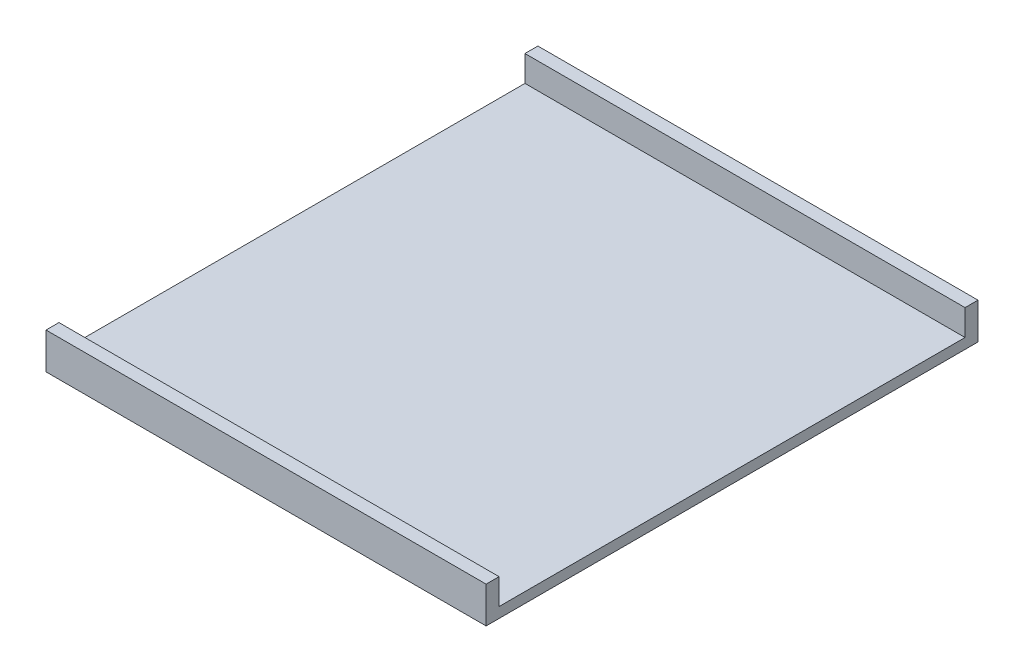
ISO-10303-21;
HEADER;
FILE_DESCRIPTION(('STEP AP214'),'2;1');
FILE_NAME('part.step','',(''),(''),'','','');
FILE_SCHEMA(('AUTOMOTIVE_DESIGN { 1 0 10303 214 1 1 1 1 }'));
ENDSEC;
DATA;
#1=APPLICATION_CONTEXT('core data for automotive mechanical design processes');
#2=APPLICATION_PROTOCOL_DEFINITION('international standard','automotive_design',2000,#1);
#3=PRODUCT_CONTEXT('',#1,'mechanical');
#4=PRODUCT('Part','Part','',(#3));
#5=PRODUCT_RELATED_PRODUCT_CATEGORY('part','',(#4));
#6=PRODUCT_DEFINITION_FORMATION('','',#4);
#7=PRODUCT_DEFINITION_CONTEXT('part definition',#1,'design');
#8=PRODUCT_DEFINITION('design','',#6,#7);
#9=PRODUCT_DEFINITION_SHAPE('','',#8);
#10=(LENGTH_UNIT() NAMED_UNIT(*) SI_UNIT(.MILLI.,.METRE.));
#11=(NAMED_UNIT(*) PLANE_ANGLE_UNIT() SI_UNIT($,.RADIAN.));
#12=(NAMED_UNIT(*) SI_UNIT($,.STERADIAN.) SOLID_ANGLE_UNIT());
#13=UNCERTAINTY_MEASURE_WITH_UNIT(LENGTH_MEASURE(1.E-05),#10,'distance_accuracy_value','');
#14=(GEOMETRIC_REPRESENTATION_CONTEXT(3) GLOBAL_UNCERTAINTY_ASSIGNED_CONTEXT((#13)) GLOBAL_UNIT_ASSIGNED_CONTEXT((#10,
#11,#12)) REPRESENTATION_CONTEXT('',''));
#15=CARTESIAN_POINT('',(0.,0.,0.));
#16=DIRECTION('',(0.,0.,1.));
#17=DIRECTION('',(1.,0.,0.));
#18=AXIS2_PLACEMENT_3D('',#15,#16,#17);
#19=CARTESIAN_POINT('',(0.,9.99999999999999,0.));
#20=DIRECTION('',(0.,-1.,0.));
#21=DIRECTION('',(0.,0.,-1.));
#22=AXIS2_PLACEMENT_3D('',#19,#20,#21);
#23=PLANE('',#22);
#24=DIRECTION('',(-1.,0.,0.));
#25=VECTOR('',#24,1.);
#26=CARTESIAN_POINT('',(80.,9.99999999999999,105.));
#27=LINE('',#26,#25);
#28=CARTESIAN_POINT('',(85.,9.99999999999999,105.));
#29=VERTEX_POINT('',#28);
#30=CARTESIAN_POINT('',(-85.,9.99999999999999,105.));
#31=VERTEX_POINT('',#30);
#32=EDGE_CURVE('E52',#29,#31,#27,.T.);
#33=ORIENTED_EDGE('',*,*,#32,.F.);
#34=DIRECTION('',(0.,0.,-1.));
#35=VECTOR('',#34,1.);
#36=CARTESIAN_POINT('',(85.,9.99999999999999,-80.));
#37=LINE('',#36,#35);
#38=CARTESIAN_POINT('',(85.,9.99999999999999,-75.));
#39=VERTEX_POINT('',#38);
#40=EDGE_CURVE('E219',#29,#39,#37,.T.);
#41=ORIENTED_EDGE('',*,*,#40,.T.);
#42=DIRECTION('',(1.,0.,0.));
#43=VECTOR('',#42,1.);
#44=CARTESIAN_POINT('',(80.,9.99999999999999,-75.));
#45=LINE('',#44,#43);
#46=CARTESIAN_POINT('',(-85.,9.99999999999999,-75.));
#47=VERTEX_POINT('',#46);
#48=EDGE_CURVE('E220',#47,#39,#45,.T.);
#49=ORIENTED_EDGE('',*,*,#48,.F.);
#50=DIRECTION('',(0.,0.,1.));
#51=VECTOR('',#50,1.);
#52=CARTESIAN_POINT('',(-85.,9.99999999999999,110.));
#53=LINE('',#52,#51);
#54=EDGE_CURVE('E57',#47,#31,#53,.T.);
#55=ORIENTED_EDGE('',*,*,#54,.T.);
#56=EDGE_LOOP('',(#33,#41,#49,#55));
#57=FACE_BOUND('',#56,.T.);
#58=ADVANCED_FACE('F37',(#57),#23,.F.);
#59=CARTESIAN_POINT('',(0.,5.99999999999999,0.));
#60=DIRECTION('',(0.,-1.,0.));
#61=DIRECTION('',(0.,0.,-1.));
#62=AXIS2_PLACEMENT_3D('',#59,#60,#61);
#63=PLANE('',#62);
#64=DIRECTION('',(0.,0.,-1.));
#65=VECTOR('',#64,1.);
#66=CARTESIAN_POINT('',(-57.5,5.99999999999999,30.));
#67=LINE('',#66,#65);
#68=CARTESIAN_POINT('',(-57.5,5.99999999999999,30.));
#69=VERTEX_POINT('',#68);
#70=CARTESIAN_POINT('',(-57.5,5.99999999999999,0.));
#71=VERTEX_POINT('',#70);
#72=EDGE_CURVE('E370',#69,#71,#67,.T.);
#73=ORIENTED_EDGE('',*,*,#72,.T.);
#74=DIRECTION('',(-1.,0.,0.));
#75=VECTOR('',#74,1.);
#76=CARTESIAN_POINT('',(-57.5,5.99999999999999,0.));
#77=LINE('',#76,#75);
#78=CARTESIAN_POINT('',(-62.5,5.99999999999999,0.));
#79=VERTEX_POINT('',#78);
#80=EDGE_CURVE('E352',#71,#79,#77,.T.);
#81=ORIENTED_EDGE('',*,*,#80,.T.);
#82=DIRECTION('',(0.,0.,-1.));
#83=VECTOR('',#82,1.);
#84=CARTESIAN_POINT('',(-62.5,5.99999999999999,30.));
#85=LINE('',#84,#83);
#86=CARTESIAN_POINT('',(-62.5,5.99999999999999,30.));
#87=VERTEX_POINT('',#86);
#88=EDGE_CURVE('E368',#87,#79,#85,.T.);
#89=ORIENTED_EDGE('',*,*,#88,.F.);
#90=DIRECTION('',(-1.,0.,0.));
#91=VECTOR('',#90,1.);
#92=CARTESIAN_POINT('',(-57.5,5.99999999999999,30.));
#93=LINE('',#92,#91);
#94=EDGE_CURVE('E334',#69,#87,#93,.T.);
#95=ORIENTED_EDGE('',*,*,#94,.F.);
#96=EDGE_LOOP('',(#73,#81,#89,#95));
#97=FACE_BOUND('',#96,.T.);
#98=DIRECTION('',(0.,0.,-1.));
#99=VECTOR('',#98,1.);
#100=CARTESIAN_POINT('',(85.,5.99999999999999,-80.));
#101=LINE('',#100,#99);
#102=CARTESIAN_POINT('',(85.,5.99999999999999,110.));
#103=VERTEX_POINT('',#102);
#104=CARTESIAN_POINT('',(85.,5.99999999999999,-80.));
#105=VERTEX_POINT('',#104);
#106=EDGE_CURVE('E302',#103,#105,#101,.T.);
#107=ORIENTED_EDGE('',*,*,#106,.F.);
#108=DIRECTION('',(1.,0.,0.));
#109=VECTOR('',#108,1.);
#110=CARTESIAN_POINT('',(0.,5.99999999999999,110.));
#111=LINE('',#110,#109);
#112=CARTESIAN_POINT('',(-85.,5.99999999999999,110.));
#113=VERTEX_POINT('',#112);
#114=EDGE_CURVE('E304',#113,#103,#111,.T.);
#115=ORIENTED_EDGE('',*,*,#114,.F.);
#116=DIRECTION('',(0.,0.,1.));
#117=VECTOR('',#116,1.);
#118=CARTESIAN_POINT('',(-85.,5.99999999999999,110.));
#119=LINE('',#118,#117);
#120=CARTESIAN_POINT('',(-85.,5.99999999999999,-80.));
#121=VERTEX_POINT('',#120);
#122=EDGE_CURVE('E310',#121,#113,#119,.T.);
#123=ORIENTED_EDGE('',*,*,#122,.F.);
#124=DIRECTION('',(-1.,0.,0.));
#125=VECTOR('',#124,1.);
#126=CARTESIAN_POINT('',(-85.,5.99999999999999,-80.));
#127=LINE('',#126,#125);
#128=EDGE_CURVE('E308',#105,#121,#127,.T.);
#129=ORIENTED_EDGE('',*,*,#128,.F.);
#130=EDGE_LOOP('',(#107,#115,#123,#129));
#131=FACE_BOUND('',#130,.T.);
#132=DIRECTION('',(0.,0.,-1.));
#133=VECTOR('',#132,1.);
#134=CARTESIAN_POINT('',(57.5,5.99999999999999,30.));
#135=LINE('',#134,#133);
#136=CARTESIAN_POINT('',(57.5,5.99999999999999,30.));
#137=VERTEX_POINT('',#136);
#138=CARTESIAN_POINT('',(57.5,5.99999999999999,0.));
#139=VERTEX_POINT('',#138);
#140=EDGE_CURVE('E285',#137,#139,#135,.T.);
#141=ORIENTED_EDGE('',*,*,#140,.F.);
#142=DIRECTION('',(-1.,0.,0.));
#143=VECTOR('',#142,1.);
#144=CARTESIAN_POINT('',(57.5,5.99999999999999,30.));
#145=LINE('',#144,#143);
#146=CARTESIAN_POINT('',(62.5,5.99999999999999,30.));
#147=VERTEX_POINT('',#146);
#148=EDGE_CURVE('E256',#147,#137,#145,.T.);
#149=ORIENTED_EDGE('',*,*,#148,.F.);
#150=DIRECTION('',(0.,0.,-1.));
#151=VECTOR('',#150,1.);
#152=CARTESIAN_POINT('',(62.5,5.99999999999999,30.));
#153=LINE('',#152,#151);
#154=CARTESIAN_POINT('',(62.5,5.99999999999999,0.));
#155=VERTEX_POINT('',#154);
#156=EDGE_CURVE('E288',#147,#155,#153,.T.);
#157=ORIENTED_EDGE('',*,*,#156,.T.);
#158=DIRECTION('',(-1.,0.,0.));
#159=VECTOR('',#158,1.);
#160=CARTESIAN_POINT('',(57.5,5.99999999999999,0.));
#161=LINE('',#160,#159);
#162=EDGE_CURVE('E275',#155,#139,#161,.T.);
#163=ORIENTED_EDGE('',*,*,#162,.T.);
#164=EDGE_LOOP('',(#141,#149,#157,#163));
#165=FACE_BOUND('',#164,.T.);
#166=ADVANCED_FACE('F394',(#97,#131,#165),#63,.T.);
#167=CARTESIAN_POINT('',(-65.,0.,30.));
#168=DIRECTION('',(0.,1.,0.));
#169=DIRECTION('',(-1.,0.,0.));
#170=AXIS2_PLACEMENT_3D('',#167,#168,#169);
#171=PLANE('',#170);
#172=DIRECTION('',(1.,0.,0.));
#173=VECTOR('',#172,1.);
#174=CARTESIAN_POINT('',(-65.,0.,0.));
#175=LINE('',#174,#173);
#176=CARTESIAN_POINT('',(-65.,0.,0.));
#177=VERTEX_POINT('',#176);
#178=CARTESIAN_POINT('',(-55.,0.,0.));
#179=VERTEX_POINT('',#178);
#180=EDGE_CURVE('E323',#177,#179,#175,.T.);
#181=ORIENTED_EDGE('',*,*,#180,.T.);
#182=DIRECTION('',(0.,0.,-1.));
#183=VECTOR('',#182,1.);
#184=CARTESIAN_POINT('',(-55.,0.,30.));
#185=LINE('',#184,#183);
#186=CARTESIAN_POINT('',(-55.,0.,30.));
#187=VERTEX_POINT('',#186);
#188=EDGE_CURVE('E11',#187,#179,#185,.T.);
#189=ORIENTED_EDGE('',*,*,#188,.F.);
#190=DIRECTION('',(1.,0.,0.));
#191=VECTOR('',#190,1.);
#192=CARTESIAN_POINT('',(-65.,0.,30.));
#193=LINE('',#192,#191);
#194=CARTESIAN_POINT('',(-65.,0.,30.));
#195=VERTEX_POINT('',#194);
#196=EDGE_CURVE('E324',#195,#187,#193,.T.);
#197=ORIENTED_EDGE('',*,*,#196,.F.);
#198=DIRECTION('',(0.,0.,-1.));
#199=VECTOR('',#198,1.);
#200=CARTESIAN_POINT('',(-65.,0.,30.));
#201=LINE('',#200,#199);
#202=EDGE_CURVE('E342',#195,#177,#201,.T.);
#203=ORIENTED_EDGE('',*,*,#202,.T.);
#204=EDGE_LOOP('',(#181,#189,#197,#203));
#205=FACE_BOUND('',#204,.T.);
#206=ADVANCED_FACE('F39',(#205),#171,.F.);
#207=CARTESIAN_POINT('',(-55.,0.,30.));
#208=DIRECTION('',(-1.,0.,0.));
#209=DIRECTION('',(0.,0.,1.));
#210=AXIS2_PLACEMENT_3D('',#207,#208,#209);
#211=PLANE('',#210);
#212=DIRECTION('',(0.,1.,0.));
#213=VECTOR('',#212,1.);
#214=CARTESIAN_POINT('',(-55.,0.,0.));
#215=LINE('',#214,#213);
#216=CARTESIAN_POINT('',(-55.,2.99999999999999,0.));
#217=VERTEX_POINT('',#216);
#218=EDGE_CURVE('E345',#179,#217,#215,.T.);
#219=ORIENTED_EDGE('',*,*,#218,.T.);
#220=DIRECTION('',(0.,0.,-1.));
#221=VECTOR('',#220,1.);
#222=CARTESIAN_POINT('',(-55.,2.99999999999999,30.));
#223=LINE('',#222,#221);
#224=CARTESIAN_POINT('',(-55.,2.99999999999999,30.));
#225=VERTEX_POINT('',#224);
#226=EDGE_CURVE('E45',#225,#217,#223,.T.);
#227=ORIENTED_EDGE('',*,*,#226,.F.);
#228=DIRECTION('',(0.,1.,0.));
#229=VECTOR('',#228,1.);
#230=CARTESIAN_POINT('',(-55.,0.,30.));
#231=LINE('',#230,#229);
#232=EDGE_CURVE('E327',#187,#225,#231,.T.);
#233=ORIENTED_EDGE('',*,*,#232,.F.);
#234=ORIENTED_EDGE('',*,*,#188,.T.);
#235=EDGE_LOOP('',(#219,#227,#233,#234));
#236=FACE_BOUND('',#235,.T.);
#237=ADVANCED_FACE('F416',(#236),#211,.F.);
#238=CARTESIAN_POINT('',(-55.,2.99999999999999,30.));
#239=DIRECTION('',(0.,-1.,0.));
#240=DIRECTION('',(1.,0.,0.));
#241=AXIS2_PLACEMENT_3D('',#238,#239,#240);
#242=PLANE('',#241);
#243=DIRECTION('',(-1.,0.,0.));
#244=VECTOR('',#243,1.);
#245=CARTESIAN_POINT('',(-55.,2.99999999999999,0.));
#246=LINE('',#245,#244);
#247=CARTESIAN_POINT('',(-57.5,2.99999999999999,0.));
#248=VERTEX_POINT('',#247);
#249=EDGE_CURVE('E347',#217,#248,#246,.T.);
#250=ORIENTED_EDGE('',*,*,#249,.T.);
#251=DIRECTION('',(0.,0.,-1.));
#252=VECTOR('',#251,1.);
#253=CARTESIAN_POINT('',(-57.5,2.99999999999999,30.));
#254=LINE('',#253,#252);
#255=CARTESIAN_POINT('',(-57.5,2.99999999999999,30.));
#256=VERTEX_POINT('',#255);
#257=EDGE_CURVE('E373',#256,#248,#254,.T.);
#258=ORIENTED_EDGE('',*,*,#257,.F.);
#259=DIRECTION('',(-1.,0.,0.));
#260=VECTOR('',#259,1.);
#261=CARTESIAN_POINT('',(-55.,2.99999999999999,30.));
#262=LINE('',#261,#260);
#263=EDGE_CURVE('E330',#225,#256,#262,.T.);
#264=ORIENTED_EDGE('',*,*,#263,.F.);
#265=ORIENTED_EDGE('',*,*,#226,.T.);
#266=EDGE_LOOP('',(#250,#258,#264,#265));
#267=FACE_BOUND('',#266,.T.);
#268=ADVANCED_FACE('F380',(#267),#242,.F.);
#269=CARTESIAN_POINT('',(-57.5,2.99999999999999,30.));
#270=DIRECTION('',(-1.,0.,0.));
#271=DIRECTION('',(0.,0.,1.));
#272=AXIS2_PLACEMENT_3D('',#269,#270,#271);
#273=PLANE('',#272);
#274=DIRECTION('',(0.,1.,0.));
#275=VECTOR('',#274,1.);
#276=CARTESIAN_POINT('',(-57.5,2.99999999999999,0.));
#277=LINE('',#276,#275);
#278=EDGE_CURVE('E349',#248,#71,#277,.T.);
#279=ORIENTED_EDGE('',*,*,#278,.T.);
#280=ORIENTED_EDGE('',*,*,#72,.F.);
#281=DIRECTION('',(0.,1.,0.));
#282=VECTOR('',#281,1.);
#283=CARTESIAN_POINT('',(-57.5,2.99999999999999,30.));
#284=LINE('',#283,#282);
#285=EDGE_CURVE('E332',#256,#69,#284,.T.);
#286=ORIENTED_EDGE('',*,*,#285,.F.);
#287=ORIENTED_EDGE('',*,*,#257,.T.);
#288=EDGE_LOOP('',(#279,#280,#286,#287));
#289=FACE_BOUND('',#288,.T.);
#290=ADVANCED_FACE('F390',(#289),#273,.F.);
#291=CARTESIAN_POINT('',(-62.5,5.99999999999999,30.));
#292=DIRECTION('',(1.,0.,0.));
#293=DIRECTION('',(0.,0.,-1.));
#294=AXIS2_PLACEMENT_3D('',#291,#292,#293);
#295=PLANE('',#294);
#296=DIRECTION('',(0.,-1.,0.));
#297=VECTOR('',#296,1.);
#298=CARTESIAN_POINT('',(-62.5,5.99999999999999,0.));
#299=LINE('',#298,#297);
#300=CARTESIAN_POINT('',(-62.5,2.99999999999999,0.));
#301=VERTEX_POINT('',#300);
#302=EDGE_CURVE('E355',#79,#301,#299,.T.);
#303=ORIENTED_EDGE('',*,*,#302,.T.);
#304=DIRECTION('',(0.,0.,-1.));
#305=VECTOR('',#304,1.);
#306=CARTESIAN_POINT('',(-62.5,2.99999999999999,30.));
#307=LINE('',#306,#305);
#308=CARTESIAN_POINT('',(-62.5,2.99999999999999,30.));
#309=VERTEX_POINT('',#308);
#310=EDGE_CURVE('E365',#309,#301,#307,.T.);
#311=ORIENTED_EDGE('',*,*,#310,.F.);
#312=DIRECTION('',(0.,-1.,0.));
#313=VECTOR('',#312,1.);
#314=CARTESIAN_POINT('',(-62.5,5.99999999999999,30.));
#315=LINE('',#314,#313);
#316=EDGE_CURVE('E336',#87,#309,#315,.T.);
#317=ORIENTED_EDGE('',*,*,#316,.F.);
#318=ORIENTED_EDGE('',*,*,#88,.T.);
#319=EDGE_LOOP('',(#303,#311,#317,#318));
#320=FACE_BOUND('',#319,.T.);
#321=ADVANCED_FACE('F402',(#320),#295,.F.);
#322=CARTESIAN_POINT('',(-62.5,2.99999999999999,30.));
#323=DIRECTION('',(0.,-1.,0.));
#324=DIRECTION('',(1.,0.,0.));
#325=AXIS2_PLACEMENT_3D('',#322,#323,#324);
#326=PLANE('',#325);
#327=DIRECTION('',(-1.,0.,0.));
#328=VECTOR('',#327,1.);
#329=CARTESIAN_POINT('',(-62.5,2.99999999999999,0.));
#330=LINE('',#329,#328);
#331=CARTESIAN_POINT('',(-65.,2.99999999999999,0.));
#332=VERTEX_POINT('',#331);
#333=EDGE_CURVE('E357',#301,#332,#330,.T.);
#334=ORIENTED_EDGE('',*,*,#333,.T.);
#335=DIRECTION('',(0.,0.,-1.));
#336=VECTOR('',#335,1.);
#337=CARTESIAN_POINT('',(-65.,2.99999999999999,30.));
#338=LINE('',#337,#336);
#339=CARTESIAN_POINT('',(-65.,2.99999999999999,30.));
#340=VERTEX_POINT('',#339);
#341=EDGE_CURVE('E362',#340,#332,#338,.T.);
#342=ORIENTED_EDGE('',*,*,#341,.F.);
#343=DIRECTION('',(-1.,0.,0.));
#344=VECTOR('',#343,1.);
#345=CARTESIAN_POINT('',(-62.5,2.99999999999999,30.));
#346=LINE('',#345,#344);
#347=EDGE_CURVE('E338',#309,#340,#346,.T.);
#348=ORIENTED_EDGE('',*,*,#347,.F.);
#349=ORIENTED_EDGE('',*,*,#310,.T.);
#350=EDGE_LOOP('',(#334,#342,#348,#349));
#351=FACE_BOUND('',#350,.T.);
#352=ADVANCED_FACE('F407',(#351),#326,.F.);
#353=CARTESIAN_POINT('',(-65.,2.99999999999999,30.));
#354=DIRECTION('',(1.,0.,0.));
#355=DIRECTION('',(0.,0.,-1.));
#356=AXIS2_PLACEMENT_3D('',#353,#354,#355);
#357=PLANE('',#356);
#358=DIRECTION('',(0.,-1.,0.));
#359=VECTOR('',#358,1.);
#360=CARTESIAN_POINT('',(-65.,2.99999999999999,0.));
#361=LINE('',#360,#359);
#362=EDGE_CURVE('E328',#332,#177,#361,.T.);
#363=ORIENTED_EDGE('',*,*,#362,.T.);
#364=ORIENTED_EDGE('',*,*,#202,.F.);
#365=DIRECTION('',(0.,-1.,0.));
#366=VECTOR('',#365,1.);
#367=CARTESIAN_POINT('',(-65.,2.99999999999999,30.));
#368=LINE('',#367,#366);
#369=EDGE_CURVE('E340',#340,#195,#368,.T.);
#370=ORIENTED_EDGE('',*,*,#369,.F.);
#371=ORIENTED_EDGE('',*,*,#341,.T.);
#372=EDGE_LOOP('',(#363,#364,#370,#371));
#373=FACE_BOUND('',#372,.T.);
#374=ADVANCED_FACE('F413',(#373),#357,.F.);
#375=CARTESIAN_POINT('',(0.,0.,30.));
#376=DIRECTION('',(0.,0.,1.));
#377=DIRECTION('',(1.,0.,0.));
#378=AXIS2_PLACEMENT_3D('',#375,#376,#377);
#379=PLANE('',#378);
#380=ORIENTED_EDGE('',*,*,#196,.T.);
#381=ORIENTED_EDGE('',*,*,#232,.T.);
#382=ORIENTED_EDGE('',*,*,#263,.T.);
#383=ORIENTED_EDGE('',*,*,#285,.T.);
#384=ORIENTED_EDGE('',*,*,#94,.T.);
#385=ORIENTED_EDGE('',*,*,#316,.T.);
#386=ORIENTED_EDGE('',*,*,#347,.T.);
#387=ORIENTED_EDGE('',*,*,#369,.T.);
#388=EDGE_LOOP('',(#380,#381,#382,#383,#384,#385,#386,#387));
#389=FACE_BOUND('',#388,.T.);
#390=ADVANCED_FACE('F399',(#389),#379,.T.);
#391=CARTESIAN_POINT('',(0.,0.,0.));
#392=DIRECTION('',(0.,0.,1.));
#393=DIRECTION('',(1.,0.,0.));
#394=AXIS2_PLACEMENT_3D('',#391,#392,#393);
#395=PLANE('',#394);
#396=ORIENTED_EDGE('',*,*,#180,.F.);
#397=ORIENTED_EDGE('',*,*,#362,.F.);
#398=ORIENTED_EDGE('',*,*,#333,.F.);
#399=ORIENTED_EDGE('',*,*,#302,.F.);
#400=ORIENTED_EDGE('',*,*,#80,.F.);
#401=ORIENTED_EDGE('',*,*,#278,.F.);
#402=ORIENTED_EDGE('',*,*,#249,.F.);
#403=ORIENTED_EDGE('',*,*,#218,.F.);
#404=EDGE_LOOP('',(#396,#397,#398,#399,#400,#401,#402,#403));
#405=FACE_BOUND('',#404,.T.);
#406=ADVANCED_FACE('F386',(#405),#395,.F.);
#407=CARTESIAN_POINT('',(85.,9.99999999999999,-80.));
#408=DIRECTION('',(-1.,0.,0.));
#409=DIRECTION('',(0.,0.,1.));
#410=AXIS2_PLACEMENT_3D('',#407,#408,#409);
#411=PLANE('',#410);
#412=ORIENTED_EDGE('',*,*,#106,.T.);
#413=DIRECTION('',(0.,-1.,0.));
#414=VECTOR('',#413,1.);
#415=CARTESIAN_POINT('',(85.,9.99999999999999,-80.));
#416=LINE('',#415,#414);
#417=CARTESIAN_POINT('',(85.,20.,-80.));
#418=VERTEX_POINT('',#417);
#419=EDGE_CURVE('E318',#418,#105,#416,.T.);
#420=ORIENTED_EDGE('',*,*,#419,.F.);
#421=DIRECTION('',(0.,0.,-1.));
#422=VECTOR('',#421,1.);
#423=CARTESIAN_POINT('',(85.,20.,-75.));
#424=LINE('',#423,#422);
#425=CARTESIAN_POINT('',(85.,20.,-75.));
#426=VERTEX_POINT('',#425);
#427=EDGE_CURVE('E234',#426,#418,#424,.T.);
#428=ORIENTED_EDGE('',*,*,#427,.F.);
#429=DIRECTION('',(0.,-1.,0.));
#430=VECTOR('',#429,1.);
#431=CARTESIAN_POINT('',(85.,20.,-75.));
#432=LINE('',#431,#430);
#433=EDGE_CURVE('E236',#426,#39,#432,.T.);
#434=ORIENTED_EDGE('',*,*,#433,.T.);
#435=ORIENTED_EDGE('',*,*,#40,.F.);
#436=DIRECTION('',(0.,-1.,0.));
#437=VECTOR('',#436,1.);
#438=CARTESIAN_POINT('',(85.,20.,105.));
#439=LINE('',#438,#437);
#440=CARTESIAN_POINT('',(85.,20.,105.));
#441=VERTEX_POINT('',#440);
#442=EDGE_CURVE('E200',#441,#29,#439,.T.);
#443=ORIENTED_EDGE('',*,*,#442,.F.);
#444=DIRECTION('',(0.,0.,-1.));
#445=VECTOR('',#444,1.);
#446=CARTESIAN_POINT('',(85.,20.,110.));
#447=LINE('',#446,#445);
#448=CARTESIAN_POINT('',(85.,20.,110.));
#449=VERTEX_POINT('',#448);
#450=EDGE_CURVE('E207',#449,#441,#447,.T.);
#451=ORIENTED_EDGE('',*,*,#450,.F.);
#452=DIRECTION('',(0.,-1.,0.));
#453=VECTOR('',#452,1.);
#454=CARTESIAN_POINT('',(85.,9.99999999999999,110.));
#455=LINE('',#454,#453);
#456=EDGE_CURVE('E321',#449,#103,#455,.T.);
#457=ORIENTED_EDGE('',*,*,#456,.T.);
#458=EDGE_LOOP('',(#412,#420,#428,#434,#435,#443,#451,#457));
#459=FACE_BOUND('',#458,.T.);
#460=ADVANCED_FACE('F217',(#459),#411,.F.);
#461=CARTESIAN_POINT('',(-85.,9.99999999999999,-80.));
#462=DIRECTION('',(0.,0.,1.));
#463=DIRECTION('',(1.,0.,0.));
#464=AXIS2_PLACEMENT_3D('',#461,#462,#463);
#465=PLANE('',#464);
#466=ORIENTED_EDGE('',*,*,#128,.T.);
#467=DIRECTION('',(0.,-1.,0.));
#468=VECTOR('',#467,1.);
#469=CARTESIAN_POINT('',(-85.,9.99999999999999,-80.));
#470=LINE('',#469,#468);
#471=CARTESIAN_POINT('',(-85.,20.,-80.));
#472=VERTEX_POINT('',#471);
#473=EDGE_CURVE('E315',#472,#121,#470,.T.);
#474=ORIENTED_EDGE('',*,*,#473,.F.);
#475=DIRECTION('',(-1.,0.,0.));
#476=VECTOR('',#475,1.);
#477=CARTESIAN_POINT('',(85.,20.,-80.));
#478=LINE('',#477,#476);
#479=EDGE_CURVE('E223',#418,#472,#478,.T.);
#480=ORIENTED_EDGE('',*,*,#479,.F.);
#481=ORIENTED_EDGE('',*,*,#419,.T.);
#482=EDGE_LOOP('',(#466,#474,#480,#481));
#483=FACE_BOUND('',#482,.T.);
#484=ADVANCED_FACE('F440',(#483),#465,.F.);
#485=CARTESIAN_POINT('',(-85.,9.99999999999999,110.));
#486=DIRECTION('',(1.,0.,0.));
#487=DIRECTION('',(0.,0.,-1.));
#488=AXIS2_PLACEMENT_3D('',#485,#486,#487);
#489=PLANE('',#488);
#490=ORIENTED_EDGE('',*,*,#122,.T.);
#491=DIRECTION('',(0.,-1.,0.));
#492=VECTOR('',#491,1.);
#493=CARTESIAN_POINT('',(-85.,9.99999999999999,110.));
#494=LINE('',#493,#492);
#495=CARTESIAN_POINT('',(-85.,20.,110.));
#496=VERTEX_POINT('',#495);
#497=EDGE_CURVE('E306',#496,#113,#494,.T.);
#498=ORIENTED_EDGE('',*,*,#497,.F.);
#499=DIRECTION('',(0.,0.,1.));
#500=VECTOR('',#499,1.);
#501=CARTESIAN_POINT('',(-85.,20.,105.));
#502=LINE('',#501,#500);
#503=CARTESIAN_POINT('',(-85.,20.,105.));
#504=VERTEX_POINT('',#503);
#505=EDGE_CURVE('E206',#504,#496,#502,.T.);
#506=ORIENTED_EDGE('',*,*,#505,.F.);
#507=DIRECTION('',(0.,-1.,0.));
#508=VECTOR('',#507,1.);
#509=CARTESIAN_POINT('',(-85.,20.,105.));
#510=LINE('',#509,#508);
#511=EDGE_CURVE('E202',#504,#31,#510,.T.);
#512=ORIENTED_EDGE('',*,*,#511,.T.);
#513=ORIENTED_EDGE('',*,*,#54,.F.);
#514=DIRECTION('',(0.,-1.,0.));
#515=VECTOR('',#514,1.);
#516=CARTESIAN_POINT('',(-85.,20.,-75.));
#517=LINE('',#516,#515);
#518=CARTESIAN_POINT('',(-85.,20.,-75.));
#519=VERTEX_POINT('',#518);
#520=EDGE_CURVE('E239',#519,#47,#517,.T.);
#521=ORIENTED_EDGE('',*,*,#520,.F.);
#522=DIRECTION('',(0.,0.,1.));
#523=VECTOR('',#522,1.);
#524=CARTESIAN_POINT('',(-85.,20.,-80.));
#525=LINE('',#524,#523);
#526=EDGE_CURVE('E230',#472,#519,#525,.T.);
#527=ORIENTED_EDGE('',*,*,#526,.F.);
#528=ORIENTED_EDGE('',*,*,#473,.T.);
#529=EDGE_LOOP('',(#490,#498,#506,#512,#513,#521,#527,#528));
#530=FACE_BOUND('',#529,.T.);
#531=ADVANCED_FACE('F436',(#530),#489,.F.);
#532=CARTESIAN_POINT('',(0.,9.99999999999999,110.));
#533=DIRECTION('',(0.,0.,-1.));
#534=DIRECTION('',(-1.,0.,0.));
#535=AXIS2_PLACEMENT_3D('',#532,#533,#534);
#536=PLANE('',#535);
#537=ORIENTED_EDGE('',*,*,#114,.T.);
#538=ORIENTED_EDGE('',*,*,#456,.F.);
#539=DIRECTION('',(1.,0.,0.));
#540=VECTOR('',#539,1.);
#541=CARTESIAN_POINT('',(-85.,20.,110.));
#542=LINE('',#541,#540);
#543=EDGE_CURVE('E213',#496,#449,#542,.T.);
#544=ORIENTED_EDGE('',*,*,#543,.F.);
#545=ORIENTED_EDGE('',*,*,#497,.T.);
#546=EDGE_LOOP('',(#537,#538,#544,#545));
#547=FACE_BOUND('',#546,.T.);
#548=ADVANCED_FACE('F433',(#547),#536,.F.);
#549=CARTESIAN_POINT('',(55.,0.,30.));
#550=DIRECTION('',(1.,0.,0.));
#551=DIRECTION('',(0.,0.,-1.));
#552=AXIS2_PLACEMENT_3D('',#549,#550,#551);
#553=PLANE('',#552);
#554=DIRECTION('',(0.,-1.,0.));
#555=VECTOR('',#554,1.);
#556=CARTESIAN_POINT('',(55.,0.,0.));
#557=LINE('',#556,#555);
#558=CARTESIAN_POINT('',(55.,2.99999999999999,0.));
#559=VERTEX_POINT('',#558);
#560=CARTESIAN_POINT('',(55.,0.,0.));
#561=VERTEX_POINT('',#560);
#562=EDGE_CURVE('E242',#559,#561,#557,.T.);
#563=ORIENTED_EDGE('',*,*,#562,.T.);
#564=DIRECTION('',(0.,0.,-1.));
#565=VECTOR('',#564,1.);
#566=CARTESIAN_POINT('',(55.,0.,30.));
#567=LINE('',#566,#565);
#568=CARTESIAN_POINT('',(55.,0.,30.));
#569=VERTEX_POINT('',#568);
#570=EDGE_CURVE('E299',#569,#561,#567,.T.);
#571=ORIENTED_EDGE('',*,*,#570,.F.);
#572=DIRECTION('',(0.,-1.,0.));
#573=VECTOR('',#572,1.);
#574=CARTESIAN_POINT('',(55.,0.,30.));
#575=LINE('',#574,#573);
#576=CARTESIAN_POINT('',(55.,2.99999999999999,30.));
#577=VERTEX_POINT('',#576);
#578=EDGE_CURVE('E243',#577,#569,#575,.T.);
#579=ORIENTED_EDGE('',*,*,#578,.F.);
#580=DIRECTION('',(0.,0.,-1.));
#581=VECTOR('',#580,1.);
#582=CARTESIAN_POINT('',(55.,2.99999999999999,30.));
#583=LINE('',#582,#581);
#584=EDGE_CURVE('E263',#577,#559,#583,.T.);
#585=ORIENTED_EDGE('',*,*,#584,.T.);
#586=EDGE_LOOP('',(#563,#571,#579,#585));
#587=FACE_BOUND('',#586,.T.);
#588=ADVANCED_FACE('F430',(#587),#553,.F.);
#589=CARTESIAN_POINT('',(65.,0.,30.));
#590=DIRECTION('',(0.,1.,0.));
#591=DIRECTION('',(-1.,0.,0.));
#592=AXIS2_PLACEMENT_3D('',#589,#590,#591);
#593=PLANE('',#592);
#594=DIRECTION('',(1.,0.,0.));
#595=VECTOR('',#594,1.);
#596=CARTESIAN_POINT('',(65.,0.,0.));
#597=LINE('',#596,#595);
#598=CARTESIAN_POINT('',(65.,0.,0.));
#599=VERTEX_POINT('',#598);
#600=EDGE_CURVE('E266',#561,#599,#597,.T.);
#601=ORIENTED_EDGE('',*,*,#600,.T.);
#602=DIRECTION('',(0.,0.,-1.));
#603=VECTOR('',#602,1.);
#604=CARTESIAN_POINT('',(65.,0.,30.));
#605=LINE('',#604,#603);
#606=CARTESIAN_POINT('',(65.,0.,30.));
#607=VERTEX_POINT('',#606);
#608=EDGE_CURVE('E296',#607,#599,#605,.T.);
#609=ORIENTED_EDGE('',*,*,#608,.F.);
#610=DIRECTION('',(1.,0.,0.));
#611=VECTOR('',#610,1.);
#612=CARTESIAN_POINT('',(65.,0.,30.));
#613=LINE('',#612,#611);
#614=EDGE_CURVE('E246',#569,#607,#613,.T.);
#615=ORIENTED_EDGE('',*,*,#614,.F.);
#616=ORIENTED_EDGE('',*,*,#570,.T.);
#617=EDGE_LOOP('',(#601,#609,#615,#616));
#618=FACE_BOUND('',#617,.T.);
#619=ADVANCED_FACE('F507',(#618),#593,.F.);
#620=CARTESIAN_POINT('',(65.,2.99999999999999,30.));
#621=DIRECTION('',(-1.,0.,0.));
#622=DIRECTION('',(0.,0.,1.));
#623=AXIS2_PLACEMENT_3D('',#620,#621,#622);
#624=PLANE('',#623);
#625=DIRECTION('',(0.,1.,0.));
#626=VECTOR('',#625,1.);
#627=CARTESIAN_POINT('',(65.,2.99999999999999,0.));
#628=LINE('',#627,#626);
#629=CARTESIAN_POINT('',(65.,2.99999999999999,0.));
#630=VERTEX_POINT('',#629);
#631=EDGE_CURVE('E268',#599,#630,#628,.T.);
#632=ORIENTED_EDGE('',*,*,#631,.T.);
#633=DIRECTION('',(0.,0.,-1.));
#634=VECTOR('',#633,1.);
#635=CARTESIAN_POINT('',(65.,2.99999999999999,30.));
#636=LINE('',#635,#634);
#637=CARTESIAN_POINT('',(65.,2.99999999999999,30.));
#638=VERTEX_POINT('',#637);
#639=EDGE_CURVE('E293',#638,#630,#636,.T.);
#640=ORIENTED_EDGE('',*,*,#639,.F.);
#641=DIRECTION('',(0.,1.,0.));
#642=VECTOR('',#641,1.);
#643=CARTESIAN_POINT('',(65.,2.99999999999999,30.));
#644=LINE('',#643,#642);
#645=EDGE_CURVE('E249',#607,#638,#644,.T.);
#646=ORIENTED_EDGE('',*,*,#645,.F.);
#647=ORIENTED_EDGE('',*,*,#608,.T.);
#648=EDGE_LOOP('',(#632,#640,#646,#647));
#649=FACE_BOUND('',#648,.T.);
#650=ADVANCED_FACE('F514',(#649),#624,.F.);
#651=CARTESIAN_POINT('',(62.5,2.99999999999999,30.));
#652=DIRECTION('',(0.,-1.,0.));
#653=DIRECTION('',(1.,0.,0.));
#654=AXIS2_PLACEMENT_3D('',#651,#652,#653);
#655=PLANE('',#654);
#656=DIRECTION('',(-1.,0.,0.));
#657=VECTOR('',#656,1.);
#658=CARTESIAN_POINT('',(62.5,2.99999999999999,0.));
#659=LINE('',#658,#657);
#660=CARTESIAN_POINT('',(62.5,2.99999999999999,0.));
#661=VERTEX_POINT('',#660);
#662=EDGE_CURVE('E270',#630,#661,#659,.T.);
#663=ORIENTED_EDGE('',*,*,#662,.T.);
#664=DIRECTION('',(0.,0.,-1.));
#665=VECTOR('',#664,1.);
#666=CARTESIAN_POINT('',(62.5,2.99999999999999,30.));
#667=LINE('',#666,#665);
#668=CARTESIAN_POINT('',(62.5,2.99999999999999,30.));
#669=VERTEX_POINT('',#668);
#670=EDGE_CURVE('E290',#669,#661,#667,.T.);
#671=ORIENTED_EDGE('',*,*,#670,.F.);
#672=DIRECTION('',(-1.,0.,0.));
#673=VECTOR('',#672,1.);
#674=CARTESIAN_POINT('',(62.5,2.99999999999999,30.));
#675=LINE('',#674,#673);
#676=EDGE_CURVE('E251',#638,#669,#675,.T.);
#677=ORIENTED_EDGE('',*,*,#676,.F.);
#678=ORIENTED_EDGE('',*,*,#639,.T.);
#679=EDGE_LOOP('',(#663,#671,#677,#678));
#680=FACE_BOUND('',#679,.T.);
#681=ADVANCED_FACE('F521',(#680),#655,.F.);
#682=CARTESIAN_POINT('',(62.5,5.99999999999999,30.));
#683=DIRECTION('',(-1.,0.,0.));
#684=DIRECTION('',(0.,0.,1.));
#685=AXIS2_PLACEMENT_3D('',#682,#683,#684);
#686=PLANE('',#685);
#687=DIRECTION('',(0.,1.,0.));
#688=VECTOR('',#687,1.);
#689=CARTESIAN_POINT('',(62.5,5.99999999999999,0.));
#690=LINE('',#689,#688);
#691=EDGE_CURVE('E272',#661,#155,#690,.T.);
#692=ORIENTED_EDGE('',*,*,#691,.T.);
#693=ORIENTED_EDGE('',*,*,#156,.F.);
#694=DIRECTION('',(0.,1.,0.));
#695=VECTOR('',#694,1.);
#696=CARTESIAN_POINT('',(62.5,5.99999999999999,30.));
#697=LINE('',#696,#695);
#698=EDGE_CURVE('E253',#669,#147,#697,.T.);
#699=ORIENTED_EDGE('',*,*,#698,.F.);
#700=ORIENTED_EDGE('',*,*,#670,.T.);
#701=EDGE_LOOP('',(#692,#693,#699,#700));
#702=FACE_BOUND('',#701,.T.);
#703=ADVANCED_FACE('F529',(#702),#686,.F.);
#704=CARTESIAN_POINT('',(57.5,2.99999999999999,30.));
#705=DIRECTION('',(1.,0.,0.));
#706=DIRECTION('',(0.,0.,-1.));
#707=AXIS2_PLACEMENT_3D('',#704,#705,#706);
#708=PLANE('',#707);
#709=DIRECTION('',(0.,-1.,0.));
#710=VECTOR('',#709,1.);
#711=CARTESIAN_POINT('',(57.5,2.99999999999999,0.));
#712=LINE('',#711,#710);
#713=CARTESIAN_POINT('',(57.5,2.99999999999999,0.));
#714=VERTEX_POINT('',#713);
#715=EDGE_CURVE('E277',#139,#714,#712,.T.);
#716=ORIENTED_EDGE('',*,*,#715,.T.);
#717=DIRECTION('',(0.,0.,-1.));
#718=VECTOR('',#717,1.);
#719=CARTESIAN_POINT('',(57.5,2.99999999999999,30.));
#720=LINE('',#719,#718);
#721=CARTESIAN_POINT('',(57.5,2.99999999999999,30.));
#722=VERTEX_POINT('',#721);
#723=EDGE_CURVE('E282',#722,#714,#720,.T.);
#724=ORIENTED_EDGE('',*,*,#723,.F.);
#725=DIRECTION('',(0.,-1.,0.));
#726=VECTOR('',#725,1.);
#727=CARTESIAN_POINT('',(57.5,2.99999999999999,30.));
#728=LINE('',#727,#726);
#729=EDGE_CURVE('E259',#137,#722,#728,.T.);
#730=ORIENTED_EDGE('',*,*,#729,.F.);
#731=ORIENTED_EDGE('',*,*,#140,.T.);
#732=EDGE_LOOP('',(#716,#724,#730,#731));
#733=FACE_BOUND('',#732,.T.);
#734=ADVANCED_FACE('F537',(#733),#708,.F.);
#735=CARTESIAN_POINT('',(55.,2.99999999999999,30.));
#736=DIRECTION('',(0.,-1.,0.));
#737=DIRECTION('',(1.,0.,0.));
#738=AXIS2_PLACEMENT_3D('',#735,#736,#737);
#739=PLANE('',#738);
#740=DIRECTION('',(-1.,0.,0.));
#741=VECTOR('',#740,1.);
#742=CARTESIAN_POINT('',(55.,2.99999999999999,0.));
#743=LINE('',#742,#741);
#744=EDGE_CURVE('E247',#714,#559,#743,.T.);
#745=ORIENTED_EDGE('',*,*,#744,.T.);
#746=ORIENTED_EDGE('',*,*,#584,.F.);
#747=DIRECTION('',(-1.,0.,0.));
#748=VECTOR('',#747,1.);
#749=CARTESIAN_POINT('',(55.,2.99999999999999,30.));
#750=LINE('',#749,#748);
#751=EDGE_CURVE('E261',#722,#577,#750,.T.);
#752=ORIENTED_EDGE('',*,*,#751,.F.);
#753=ORIENTED_EDGE('',*,*,#723,.T.);
#754=EDGE_LOOP('',(#745,#746,#752,#753));
#755=FACE_BOUND('',#754,.T.);
#756=ADVANCED_FACE('F545',(#755),#739,.F.);
#757=CARTESIAN_POINT('',(0.,0.,30.));
#758=DIRECTION('',(0.,0.,-1.));
#759=DIRECTION('',(-1.,0.,0.));
#760=AXIS2_PLACEMENT_3D('',#757,#758,#759);
#761=PLANE('',#760);
#762=ORIENTED_EDGE('',*,*,#578,.T.);
#763=ORIENTED_EDGE('',*,*,#614,.T.);
#764=ORIENTED_EDGE('',*,*,#645,.T.);
#765=ORIENTED_EDGE('',*,*,#676,.T.);
#766=ORIENTED_EDGE('',*,*,#698,.T.);
#767=ORIENTED_EDGE('',*,*,#148,.T.);
#768=ORIENTED_EDGE('',*,*,#729,.T.);
#769=ORIENTED_EDGE('',*,*,#751,.T.);
#770=EDGE_LOOP('',(#762,#763,#764,#765,#766,#767,#768,#769));
#771=FACE_BOUND('',#770,.T.);
#772=ADVANCED_FACE('F553',(#771),#761,.F.);
#773=CARTESIAN_POINT('',(0.,0.,0.));
#774=DIRECTION('',(0.,0.,-1.));
#775=DIRECTION('',(-1.,0.,0.));
#776=AXIS2_PLACEMENT_3D('',#773,#774,#775);
#777=PLANE('',#776);
#778=ORIENTED_EDGE('',*,*,#562,.F.);
#779=ORIENTED_EDGE('',*,*,#744,.F.);
#780=ORIENTED_EDGE('',*,*,#715,.F.);
#781=ORIENTED_EDGE('',*,*,#162,.F.);
#782=ORIENTED_EDGE('',*,*,#691,.F.);
#783=ORIENTED_EDGE('',*,*,#662,.F.);
#784=ORIENTED_EDGE('',*,*,#631,.F.);
#785=ORIENTED_EDGE('',*,*,#600,.F.);
#786=EDGE_LOOP('',(#778,#779,#780,#781,#782,#783,#784,#785));
#787=FACE_BOUND('',#786,.T.);
#788=ADVANCED_FACE('F561',(#787),#777,.T.);
#789=CARTESIAN_POINT('',(80.,20.,-75.));
#790=DIRECTION('',(0.,0.,-1.));
#791=DIRECTION('',(-1.,0.,0.));
#792=AXIS2_PLACEMENT_3D('',#789,#790,#791);
#793=PLANE('',#792);
#794=ORIENTED_EDGE('',*,*,#48,.T.);
#795=ORIENTED_EDGE('',*,*,#433,.F.);
#796=DIRECTION('',(1.,0.,0.));
#797=VECTOR('',#796,1.);
#798=CARTESIAN_POINT('',(-85.,20.,-75.));
#799=LINE('',#798,#797);
#800=EDGE_CURVE('E232',#519,#426,#799,.T.);
#801=ORIENTED_EDGE('',*,*,#800,.F.);
#802=ORIENTED_EDGE('',*,*,#520,.T.);
#803=EDGE_LOOP('',(#794,#795,#801,#802));
#804=FACE_BOUND('',#803,.T.);
#805=ADVANCED_FACE('F569',(#804),#793,.F.);
#806=CARTESIAN_POINT('',(0.,20.,0.));
#807=DIRECTION('',(0.,1.,0.));
#808=DIRECTION('',(0.,0.,1.));
#809=AXIS2_PLACEMENT_3D('',#806,#807,#808);
#810=PLANE('',#809);
#811=ORIENTED_EDGE('',*,*,#479,.T.);
#812=ORIENTED_EDGE('',*,*,#526,.T.);
#813=ORIENTED_EDGE('',*,*,#800,.T.);
#814=ORIENTED_EDGE('',*,*,#427,.T.);
#815=EDGE_LOOP('',(#811,#812,#813,#814));
#816=FACE_BOUND('',#815,.T.);
#817=ADVANCED_FACE('F576',(#816),#810,.T.);
#818=CARTESIAN_POINT('',(80.,20.,105.));
#819=DIRECTION('',(0.,0.,1.));
#820=DIRECTION('',(1.,0.,0.));
#821=AXIS2_PLACEMENT_3D('',#818,#819,#820);
#822=PLANE('',#821);
#823=ORIENTED_EDGE('',*,*,#32,.T.);
#824=ORIENTED_EDGE('',*,*,#511,.F.);
#825=DIRECTION('',(-1.,0.,0.));
#826=VECTOR('',#825,1.);
#827=CARTESIAN_POINT('',(80.,20.,105.));
#828=LINE('',#827,#826);
#829=EDGE_CURVE('E196',#441,#504,#828,.T.);
#830=ORIENTED_EDGE('',*,*,#829,.F.);
#831=ORIENTED_EDGE('',*,*,#442,.T.);
#832=EDGE_LOOP('',(#823,#824,#830,#831));
#833=FACE_BOUND('',#832,.T.);
#834=ADVANCED_FACE('F198',(#833),#822,.F.);
#835=CARTESIAN_POINT('',(0.,20.,0.));
#836=DIRECTION('',(0.,-1.,0.));
#837=DIRECTION('',(0.,0.,-1.));
#838=AXIS2_PLACEMENT_3D('',#835,#836,#837);
#839=PLANE('',#838);
#840=ORIENTED_EDGE('',*,*,#450,.T.);
#841=ORIENTED_EDGE('',*,*,#829,.T.);
#842=ORIENTED_EDGE('',*,*,#505,.T.);
#843=ORIENTED_EDGE('',*,*,#543,.T.);
#844=EDGE_LOOP('',(#840,#841,#842,#843));
#845=FACE_BOUND('',#844,.T.);
#846=ADVANCED_FACE('F211',(#845),#839,.F.);
#847=CLOSED_SHELL('',(#58,#166,#206,#237,#268,#290,#321,#352,#374,#390,#406,#460,#484,#531,#548,
#588,#619,#650,#681,#703,#734,#756,#772,#788,#805,#817,#834,#846));
#848=MANIFOLD_SOLID_BREP('B2',#847);
#849=ADVANCED_BREP_SHAPE_REPRESENTATION('',(#18,#848),#14);
#850=SHAPE_DEFINITION_REPRESENTATION(#9,#849);
ENDSEC;
END-ISO-10303-21;
